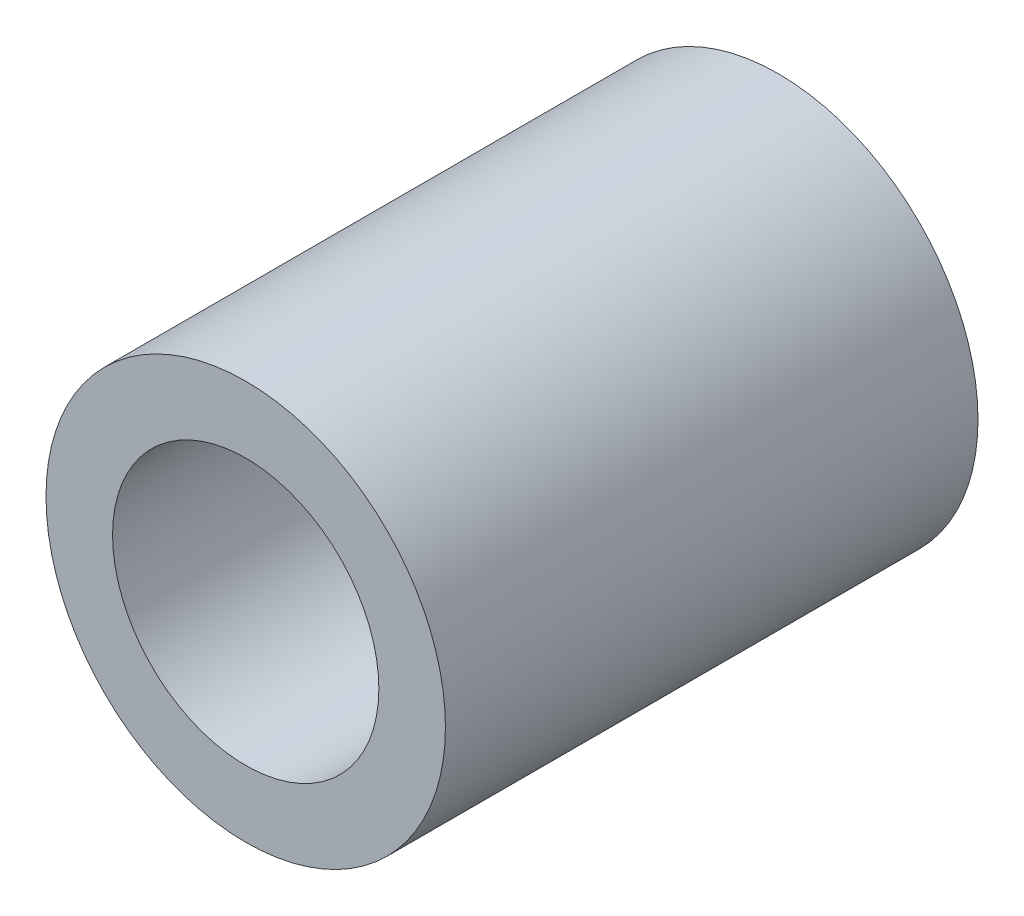
ISO-10303-21;
HEADER;
FILE_DESCRIPTION(('STEP AP214'),'2;1');
FILE_NAME('part.step','',(''),(''),'','','');
FILE_SCHEMA(('AUTOMOTIVE_DESIGN { 1 0 10303 214 1 1 1 1 }'));
ENDSEC;
DATA;
#1=APPLICATION_CONTEXT('core data for automotive mechanical design processes');
#2=APPLICATION_PROTOCOL_DEFINITION('international standard','automotive_design',2000,#1);
#3=PRODUCT_CONTEXT('',#1,'mechanical');
#4=PRODUCT('Part','Part','',(#3));
#5=PRODUCT_RELATED_PRODUCT_CATEGORY('part','',(#4));
#6=PRODUCT_DEFINITION_FORMATION('','',#4);
#7=PRODUCT_DEFINITION_CONTEXT('part definition',#1,'design');
#8=PRODUCT_DEFINITION('design','',#6,#7);
#9=PRODUCT_DEFINITION_SHAPE('','',#8);
#10=(LENGTH_UNIT() NAMED_UNIT(*) SI_UNIT(.MILLI.,.METRE.));
#11=(NAMED_UNIT(*) PLANE_ANGLE_UNIT() SI_UNIT($,.RADIAN.));
#12=(NAMED_UNIT(*) SI_UNIT($,.STERADIAN.) SOLID_ANGLE_UNIT());
#13=UNCERTAINTY_MEASURE_WITH_UNIT(LENGTH_MEASURE(1.E-05),#10,'distance_accuracy_value','');
#14=(GEOMETRIC_REPRESENTATION_CONTEXT(3) GLOBAL_UNCERTAINTY_ASSIGNED_CONTEXT((#13)) GLOBAL_UNIT_ASSIGNED_CONTEXT((#10,
#11,#12)) REPRESENTATION_CONTEXT('',''));
#15=CARTESIAN_POINT('',(0.,0.,0.));
#16=DIRECTION('',(0.,0.,1.));
#17=DIRECTION('',(1.,0.,0.));
#18=AXIS2_PLACEMENT_3D('',#15,#16,#17);
#19=CARTESIAN_POINT('',(0.,0.,6.35));
#20=DIRECTION('',(0.,0.,1.));
#21=DIRECTION('',(1.,0.,0.));
#22=AXIS2_PLACEMENT_3D('',#19,#20,#21);
#23=PLANE('',#22);
#24=CARTESIAN_POINT('',(0.,0.,6.35));
#25=DIRECTION('',(0.,0.,1.));
#26=DIRECTION('',(1.,0.,0.));
#27=AXIS2_PLACEMENT_3D('',#24,#25,#26);
#28=CIRCLE('',#27,4.7625);
#29=CARTESIAN_POINT('',(4.7625,0.,6.35));
#30=VERTEX_POINT('',#29);
#31=EDGE_CURVE('E10',#30,#30,#28,.T.);
#32=ORIENTED_EDGE('',*,*,#31,.T.);
#33=EDGE_LOOP('',(#32));
#34=FACE_BOUND('',#33,.T.);
#35=CARTESIAN_POINT('',(0.,0.,6.35));
#36=DIRECTION('',(0.,0.,1.));
#37=DIRECTION('',(1.,0.,0.));
#38=AXIS2_PLACEMENT_3D('',#35,#36,#37);
#39=CIRCLE('',#38,3.175);
#40=CARTESIAN_POINT('',(3.175,0.,6.35));
#41=VERTEX_POINT('',#40);
#42=EDGE_CURVE('E41',#41,#41,#39,.T.);
#43=ORIENTED_EDGE('',*,*,#42,.F.);
#44=EDGE_LOOP('',(#43));
#45=FACE_BOUND('',#44,.T.);
#46=ADVANCED_FACE('F30',(#34,#45),#23,.T.);
#47=CARTESIAN_POINT('',(0.,0.,-6.35));
#48=DIRECTION('',(0.,0.,1.));
#49=DIRECTION('',(1.,0.,0.));
#50=AXIS2_PLACEMENT_3D('',#47,#48,#49);
#51=PLANE('',#50);
#52=CARTESIAN_POINT('',(0.,0.,-6.35));
#53=DIRECTION('',(0.,0.,1.));
#54=DIRECTION('',(1.,0.,0.));
#55=AXIS2_PLACEMENT_3D('',#52,#53,#54);
#56=CIRCLE('',#55,4.7625);
#57=CARTESIAN_POINT('',(4.7625,0.,-6.35));
#58=VERTEX_POINT('',#57);
#59=EDGE_CURVE('E34',#58,#58,#56,.T.);
#60=ORIENTED_EDGE('',*,*,#59,.F.);
#61=EDGE_LOOP('',(#60));
#62=FACE_BOUND('',#61,.T.);
#63=CARTESIAN_POINT('',(0.,0.,-6.35));
#64=DIRECTION('',(0.,0.,1.));
#65=DIRECTION('',(1.,0.,0.));
#66=AXIS2_PLACEMENT_3D('',#63,#64,#65);
#67=CIRCLE('',#66,3.175);
#68=CARTESIAN_POINT('',(3.175,0.,-6.35));
#69=VERTEX_POINT('',#68);
#70=EDGE_CURVE('E43',#69,#69,#67,.T.);
#71=ORIENTED_EDGE('',*,*,#70,.T.);
#72=EDGE_LOOP('',(#71));
#73=FACE_BOUND('',#72,.T.);
#74=ADVANCED_FACE('F53',(#62,#73),#51,.F.);
#75=CARTESIAN_POINT('',(0.,0.,6.35));
#76=DIRECTION('',(0.,0.,-1.));
#77=DIRECTION('',(-1.,0.,0.));
#78=AXIS2_PLACEMENT_3D('',#75,#76,#77);
#79=CYLINDRICAL_SURFACE('',#78,4.7625);
#80=ORIENTED_EDGE('',*,*,#31,.F.);
#81=EDGE_LOOP('',(#80));
#82=FACE_BOUND('',#81,.T.);
#83=ORIENTED_EDGE('',*,*,#59,.T.);
#84=EDGE_LOOP('',(#83));
#85=FACE_BOUND('',#84,.T.);
#86=ADVANCED_FACE('F32',(#82,#85),#79,.T.);
#87=CARTESIAN_POINT('',(0.,0.,6.35));
#88=DIRECTION('',(0.,0.,-1.));
#89=DIRECTION('',(-1.,0.,0.));
#90=AXIS2_PLACEMENT_3D('',#87,#88,#89);
#91=CYLINDRICAL_SURFACE('',#90,3.175);
#92=ORIENTED_EDGE('',*,*,#42,.T.);
#93=EDGE_LOOP('',(#92));
#94=FACE_BOUND('',#93,.T.);
#95=ORIENTED_EDGE('',*,*,#70,.F.);
#96=EDGE_LOOP('',(#95));
#97=FACE_BOUND('',#96,.T.);
#98=ADVANCED_FACE('F49',(#94,#97),#91,.F.);
#99=CLOSED_SHELL('',(#46,#74,#86,#98));
#100=MANIFOLD_SOLID_BREP('B2',#99);
#101=ADVANCED_BREP_SHAPE_REPRESENTATION('',(#18,#100),#14);
#102=SHAPE_DEFINITION_REPRESENTATION(#9,#101);
ENDSEC;
END-ISO-10303-21;
